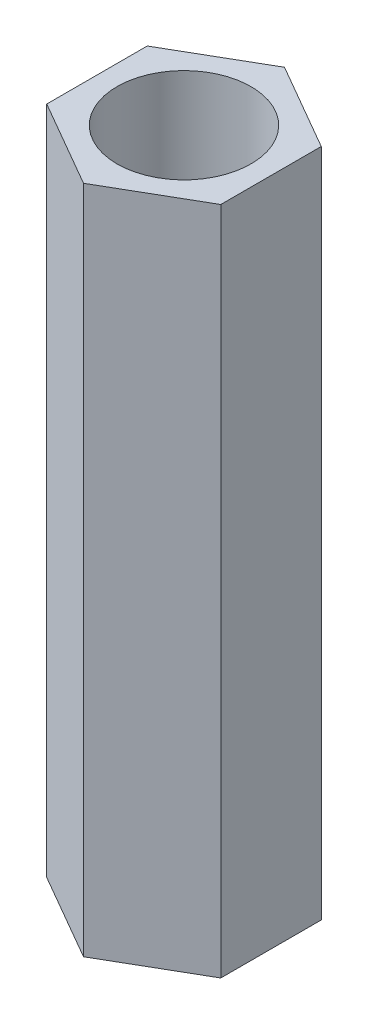
ISO-10303-21;
HEADER;
FILE_DESCRIPTION(('STEP AP214'),'2;1');
FILE_NAME('part.step','',(''),(''),'','','');
FILE_SCHEMA(('AUTOMOTIVE_DESIGN { 1 0 10303 214 1 1 1 1 }'));
ENDSEC;
DATA;
#1=APPLICATION_CONTEXT('core data for automotive mechanical design processes');
#2=APPLICATION_PROTOCOL_DEFINITION('international standard','automotive_design',2000,#1);
#3=PRODUCT_CONTEXT('',#1,'mechanical');
#4=PRODUCT('Part','Part','',(#3));
#5=PRODUCT_RELATED_PRODUCT_CATEGORY('part','',(#4));
#6=PRODUCT_DEFINITION_FORMATION('','',#4);
#7=PRODUCT_DEFINITION_CONTEXT('part definition',#1,'design');
#8=PRODUCT_DEFINITION('design','',#6,#7);
#9=PRODUCT_DEFINITION_SHAPE('','',#8);
#10=(LENGTH_UNIT() NAMED_UNIT(*) SI_UNIT(.MILLI.,.METRE.));
#11=(NAMED_UNIT(*) PLANE_ANGLE_UNIT() SI_UNIT($,.RADIAN.));
#12=(NAMED_UNIT(*) SI_UNIT($,.STERADIAN.) SOLID_ANGLE_UNIT());
#13=UNCERTAINTY_MEASURE_WITH_UNIT(LENGTH_MEASURE(1.E-05),#10,'distance_accuracy_value','');
#14=(GEOMETRIC_REPRESENTATION_CONTEXT(3) GLOBAL_UNCERTAINTY_ASSIGNED_CONTEXT((#13)) GLOBAL_UNIT_ASSIGNED_CONTEXT((#10,
#11,#12)) REPRESENTATION_CONTEXT('',''));
#15=CARTESIAN_POINT('',(0.,0.,0.));
#16=DIRECTION('',(0.,0.,1.));
#17=DIRECTION('',(1.,0.,0.));
#18=AXIS2_PLACEMENT_3D('',#15,#16,#17);
#19=CARTESIAN_POINT('',(0.,20.,0.));
#20=DIRECTION('',(0.,1.,0.));
#21=DIRECTION('',(0.,0.,1.));
#22=AXIS2_PLACEMENT_3D('',#19,#20,#21);
#23=PLANE('',#22);
#24=DIRECTION('',(-0.866025403784439,0.,-0.5));
#25=VECTOR('',#24,1.);
#26=CARTESIAN_POINT('',(2.59807621135331,20.,-1.5));
#27=LINE('',#26,#25);
#28=CARTESIAN_POINT('',(2.59807621135331,20.,-1.5));
#29=VERTEX_POINT('',#28);
#30=CARTESIAN_POINT('',(0.,20.,-3.));
#31=VERTEX_POINT('',#30);
#32=EDGE_CURVE('E150',#29,#31,#27,.T.);
#33=ORIENTED_EDGE('',*,*,#32,.T.);
#34=DIRECTION('',(-0.866025403784439,0.,0.5));
#35=VECTOR('',#34,1.);
#36=CARTESIAN_POINT('',(0.,20.,-3.));
#37=LINE('',#36,#35);
#38=CARTESIAN_POINT('',(-2.59807621135332,20.,-1.5));
#39=VERTEX_POINT('',#38);
#40=EDGE_CURVE('E98',#31,#39,#37,.T.);
#41=ORIENTED_EDGE('',*,*,#40,.T.);
#42=DIRECTION('',(0.,0.,1.));
#43=VECTOR('',#42,1.);
#44=CARTESIAN_POINT('',(-2.59807621135332,20.,-1.5));
#45=LINE('',#44,#43);
#46=CARTESIAN_POINT('',(-2.59807621135332,20.,1.5));
#47=VERTEX_POINT('',#46);
#48=EDGE_CURVE('E111',#39,#47,#45,.T.);
#49=ORIENTED_EDGE('',*,*,#48,.T.);
#50=DIRECTION('',(0.866025403784439,0.,0.5));
#51=VECTOR('',#50,1.);
#52=CARTESIAN_POINT('',(-2.59807621135332,20.,1.5));
#53=LINE('',#52,#51);
#54=CARTESIAN_POINT('',(0.,20.,3.));
#55=VERTEX_POINT('',#54);
#56=EDGE_CURVE('E105',#47,#55,#53,.T.);
#57=ORIENTED_EDGE('',*,*,#56,.T.);
#58=DIRECTION('',(0.866025403784439,0.,-0.5));
#59=VECTOR('',#58,1.);
#60=CARTESIAN_POINT('',(0.,20.,3.));
#61=LINE('',#60,#59);
#62=CARTESIAN_POINT('',(2.59807621135332,20.,1.5));
#63=VERTEX_POINT('',#62);
#64=EDGE_CURVE('E109',#55,#63,#61,.T.);
#65=ORIENTED_EDGE('',*,*,#64,.T.);
#66=DIRECTION('',(0.,0.,-1.));
#67=VECTOR('',#66,1.);
#68=CARTESIAN_POINT('',(2.59807621135332,20.,1.5));
#69=LINE('',#68,#67);
#70=EDGE_CURVE('E61',#63,#29,#69,.T.);
#71=ORIENTED_EDGE('',*,*,#70,.T.);
#72=EDGE_LOOP('',(#33,#41,#49,#57,#65,#71));
#73=FACE_BOUND('',#72,.T.);
#74=CARTESIAN_POINT('',(0.,20.,0.));
#75=DIRECTION('',(0.,1.,0.));
#76=DIRECTION('',(0.,0.,1.));
#77=AXIS2_PLACEMENT_3D('',#74,#75,#76);
#78=CIRCLE('',#77,2.);
#79=CARTESIAN_POINT('',(0.,20.,2.));
#80=VERTEX_POINT('',#79);
#81=EDGE_CURVE('E138',#80,#80,#78,.T.);
#82=ORIENTED_EDGE('',*,*,#81,.F.);
#83=EDGE_LOOP('',(#82));
#84=FACE_BOUND('',#83,.T.);
#85=ADVANCED_FACE('F43',(#73,#84),#23,.T.);
#86=CARTESIAN_POINT('',(0.,0.,0.));
#87=DIRECTION('',(0.,1.,0.));
#88=DIRECTION('',(0.,0.,1.));
#89=AXIS2_PLACEMENT_3D('',#86,#87,#88);
#90=PLANE('',#89);
#91=DIRECTION('',(-0.866025403784439,0.,-0.5));
#92=VECTOR('',#91,1.);
#93=CARTESIAN_POINT('',(2.59807621135331,0.,-1.5));
#94=LINE('',#93,#92);
#95=CARTESIAN_POINT('',(2.59807621135331,0.,-1.5));
#96=VERTEX_POINT('',#95);
#97=CARTESIAN_POINT('',(0.,0.,-3.));
#98=VERTEX_POINT('',#97);
#99=EDGE_CURVE('E133',#96,#98,#94,.T.);
#100=ORIENTED_EDGE('',*,*,#99,.F.);
#101=DIRECTION('',(0.,0.,-1.));
#102=VECTOR('',#101,1.);
#103=CARTESIAN_POINT('',(2.59807621135332,0.,1.5));
#104=LINE('',#103,#102);
#105=CARTESIAN_POINT('',(2.59807621135332,0.,1.5));
#106=VERTEX_POINT('',#105);
#107=EDGE_CURVE('E90',#106,#96,#104,.T.);
#108=ORIENTED_EDGE('',*,*,#107,.F.);
#109=DIRECTION('',(0.866025403784439,0.,-0.5));
#110=VECTOR('',#109,1.);
#111=CARTESIAN_POINT('',(0.,0.,3.));
#112=LINE('',#111,#110);
#113=CARTESIAN_POINT('',(0.,0.,3.));
#114=VERTEX_POINT('',#113);
#115=EDGE_CURVE('E84',#114,#106,#112,.T.);
#116=ORIENTED_EDGE('',*,*,#115,.F.);
#117=DIRECTION('',(0.866025403784439,0.,0.5));
#118=VECTOR('',#117,1.);
#119=CARTESIAN_POINT('',(-2.59807621135332,0.,1.5));
#120=LINE('',#119,#118);
#121=CARTESIAN_POINT('',(-2.59807621135332,0.,1.5));
#122=VERTEX_POINT('',#121);
#123=EDGE_CURVE('E120',#122,#114,#120,.T.);
#124=ORIENTED_EDGE('',*,*,#123,.F.);
#125=DIRECTION('',(0.,0.,1.));
#126=VECTOR('',#125,1.);
#127=CARTESIAN_POINT('',(-2.59807621135332,0.,-1.5));
#128=LINE('',#127,#126);
#129=CARTESIAN_POINT('',(-2.59807621135332,0.,-1.5));
#130=VERTEX_POINT('',#129);
#131=EDGE_CURVE('E141',#130,#122,#128,.T.);
#132=ORIENTED_EDGE('',*,*,#131,.F.);
#133=DIRECTION('',(-0.866025403784439,0.,0.5));
#134=VECTOR('',#133,1.);
#135=CARTESIAN_POINT('',(0.,0.,-3.));
#136=LINE('',#135,#134);
#137=EDGE_CURVE('E137',#98,#130,#136,.T.);
#138=ORIENTED_EDGE('',*,*,#137,.F.);
#139=EDGE_LOOP('',(#100,#108,#116,#124,#132,#138));
#140=FACE_BOUND('',#139,.T.);
#141=CARTESIAN_POINT('',(0.,0.,0.));
#142=DIRECTION('',(0.,1.,0.));
#143=DIRECTION('',(0.,0.,1.));
#144=AXIS2_PLACEMENT_3D('',#141,#142,#143);
#145=CIRCLE('',#144,2.);
#146=CARTESIAN_POINT('',(0.,0.,2.));
#147=VERTEX_POINT('',#146);
#148=EDGE_CURVE('E265',#147,#147,#145,.T.);
#149=ORIENTED_EDGE('',*,*,#148,.T.);
#150=EDGE_LOOP('',(#149));
#151=FACE_BOUND('',#150,.T.);
#152=ADVANCED_FACE('F163',(#140,#151),#90,.F.);
#153=CARTESIAN_POINT('',(2.59807621135331,20.,-1.5));
#154=DIRECTION('',(-0.5,0.,0.866025403784439));
#155=DIRECTION('',(0.866025403784439,0.,0.5));
#156=AXIS2_PLACEMENT_3D('',#153,#154,#155);
#157=PLANE('',#156);
#158=ORIENTED_EDGE('',*,*,#99,.T.);
#159=DIRECTION('',(0.,-1.,0.));
#160=VECTOR('',#159,1.);
#161=CARTESIAN_POINT('',(0.,20.,-3.));
#162=LINE('',#161,#160);
#163=EDGE_CURVE('E11',#31,#98,#162,.T.);
#164=ORIENTED_EDGE('',*,*,#163,.F.);
#165=ORIENTED_EDGE('',*,*,#32,.F.);
#166=DIRECTION('',(0.,-1.,0.));
#167=VECTOR('',#166,1.);
#168=CARTESIAN_POINT('',(2.59807621135331,20.,-1.5));
#169=LINE('',#168,#167);
#170=EDGE_CURVE('E129',#29,#96,#169,.T.);
#171=ORIENTED_EDGE('',*,*,#170,.T.);
#172=EDGE_LOOP('',(#158,#164,#165,#171));
#173=FACE_BOUND('',#172,.T.);
#174=ADVANCED_FACE('F45',(#173),#157,.F.);
#175=CARTESIAN_POINT('',(0.,20.,-3.));
#176=DIRECTION('',(0.5,0.,0.866025403784439));
#177=DIRECTION('',(0.866025403784439,0.,-0.5));
#178=AXIS2_PLACEMENT_3D('',#175,#176,#177);
#179=PLANE('',#178);
#180=ORIENTED_EDGE('',*,*,#137,.T.);
#181=DIRECTION('',(0.,-1.,0.));
#182=VECTOR('',#181,1.);
#183=CARTESIAN_POINT('',(-2.59807621135332,20.,-1.5));
#184=LINE('',#183,#182);
#185=EDGE_CURVE('E53',#39,#130,#184,.T.);
#186=ORIENTED_EDGE('',*,*,#185,.F.);
#187=ORIENTED_EDGE('',*,*,#40,.F.);
#188=ORIENTED_EDGE('',*,*,#163,.T.);
#189=EDGE_LOOP('',(#180,#186,#187,#188));
#190=FACE_BOUND('',#189,.T.);
#191=ADVANCED_FACE('F188',(#190),#179,.F.);
#192=CARTESIAN_POINT('',(-2.59807621135332,20.,-1.5));
#193=DIRECTION('',(1.,0.,0.));
#194=DIRECTION('',(0.,0.,-1.));
#195=AXIS2_PLACEMENT_3D('',#192,#193,#194);
#196=PLANE('',#195);
#197=ORIENTED_EDGE('',*,*,#131,.T.);
#198=DIRECTION('',(0.,-1.,0.));
#199=VECTOR('',#198,1.);
#200=CARTESIAN_POINT('',(-2.59807621135332,20.,1.5));
#201=LINE('',#200,#199);
#202=EDGE_CURVE('E122',#47,#122,#201,.T.);
#203=ORIENTED_EDGE('',*,*,#202,.F.);
#204=ORIENTED_EDGE('',*,*,#48,.F.);
#205=ORIENTED_EDGE('',*,*,#185,.T.);
#206=EDGE_LOOP('',(#197,#203,#204,#205));
#207=FACE_BOUND('',#206,.T.);
#208=ADVANCED_FACE('F160',(#207),#196,.F.);
#209=CARTESIAN_POINT('',(-2.59807621135332,20.,1.5));
#210=DIRECTION('',(0.5,0.,-0.866025403784439));
#211=DIRECTION('',(-0.866025403784439,0.,-0.5));
#212=AXIS2_PLACEMENT_3D('',#209,#210,#211);
#213=PLANE('',#212);
#214=ORIENTED_EDGE('',*,*,#123,.T.);
#215=DIRECTION('',(0.,-1.,0.));
#216=VECTOR('',#215,1.);
#217=CARTESIAN_POINT('',(0.,20.,3.));
#218=LINE('',#217,#216);
#219=EDGE_CURVE('E117',#55,#114,#218,.T.);
#220=ORIENTED_EDGE('',*,*,#219,.F.);
#221=ORIENTED_EDGE('',*,*,#56,.F.);
#222=ORIENTED_EDGE('',*,*,#202,.T.);
#223=EDGE_LOOP('',(#214,#220,#221,#222));
#224=FACE_BOUND('',#223,.T.);
#225=ADVANCED_FACE('F118',(#224),#213,.F.);
#226=CARTESIAN_POINT('',(0.,20.,3.));
#227=DIRECTION('',(-0.5,0.,-0.866025403784439));
#228=DIRECTION('',(-0.866025403784439,0.,0.5));
#229=AXIS2_PLACEMENT_3D('',#226,#227,#228);
#230=PLANE('',#229);
#231=ORIENTED_EDGE('',*,*,#115,.T.);
#232=DIRECTION('',(0.,-1.,0.));
#233=VECTOR('',#232,1.);
#234=CARTESIAN_POINT('',(2.59807621135332,20.,1.5));
#235=LINE('',#234,#233);
#236=EDGE_CURVE('E123',#63,#106,#235,.T.);
#237=ORIENTED_EDGE('',*,*,#236,.F.);
#238=ORIENTED_EDGE('',*,*,#64,.F.);
#239=ORIENTED_EDGE('',*,*,#219,.T.);
#240=EDGE_LOOP('',(#231,#237,#238,#239));
#241=FACE_BOUND('',#240,.T.);
#242=ADVANCED_FACE('F125',(#241),#230,.F.);
#243=CARTESIAN_POINT('',(2.59807621135332,20.,1.5));
#244=DIRECTION('',(-1.,0.,0.));
#245=DIRECTION('',(0.,0.,1.));
#246=AXIS2_PLACEMENT_3D('',#243,#244,#245);
#247=PLANE('',#246);
#248=ORIENTED_EDGE('',*,*,#107,.T.);
#249=ORIENTED_EDGE('',*,*,#170,.F.);
#250=ORIENTED_EDGE('',*,*,#70,.F.);
#251=ORIENTED_EDGE('',*,*,#236,.T.);
#252=EDGE_LOOP('',(#248,#249,#250,#251));
#253=FACE_BOUND('',#252,.T.);
#254=ADVANCED_FACE('F168',(#253),#247,.F.);
#255=CARTESIAN_POINT('',(0.,20.,0.));
#256=DIRECTION('',(0.,-1.,0.));
#257=DIRECTION('',(0.,0.,-1.));
#258=AXIS2_PLACEMENT_3D('',#255,#256,#257);
#259=CYLINDRICAL_SURFACE('',#258,2.);
#260=ORIENTED_EDGE('',*,*,#81,.T.);
#261=EDGE_LOOP('',(#260));
#262=FACE_BOUND('',#261,.T.);
#263=ORIENTED_EDGE('',*,*,#148,.F.);
#264=EDGE_LOOP('',(#263));
#265=FACE_BOUND('',#264,.T.);
#266=ADVANCED_FACE('F170',(#262,#265),#259,.F.);
#267=CLOSED_SHELL('',(#85,#152,#174,#191,#208,#225,#242,#254,#266));
#268=MANIFOLD_SOLID_BREP('B2',#267);
#269=ADVANCED_BREP_SHAPE_REPRESENTATION('',(#18,#268),#14);
#270=SHAPE_DEFINITION_REPRESENTATION(#9,#269);
ENDSEC;
END-ISO-10303-21;
